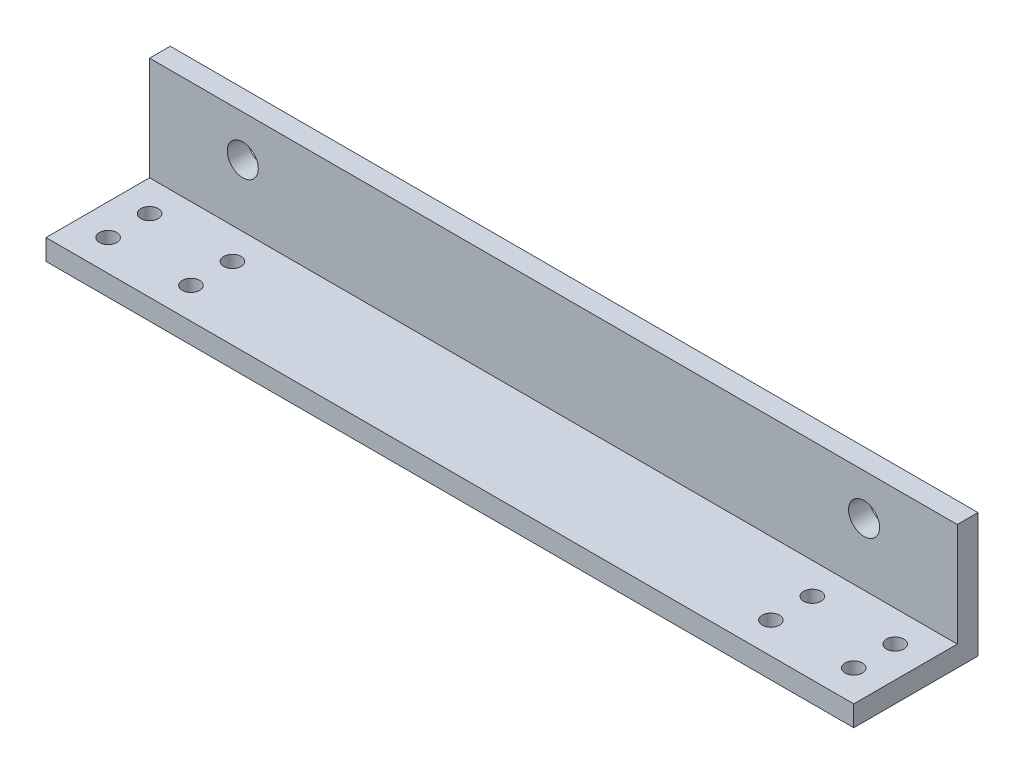
ISO-10303-21;
HEADER;
FILE_DESCRIPTION(('STEP AP214'),'2;1');
FILE_NAME('part.step','',(''),(''),'','','');
FILE_SCHEMA(('AUTOMOTIVE_DESIGN { 1 0 10303 214 1 1 1 1 }'));
ENDSEC;
DATA;
#1=APPLICATION_CONTEXT('core data for automotive mechanical design processes');
#2=APPLICATION_PROTOCOL_DEFINITION('international standard','automotive_design',2000,#1);
#3=PRODUCT_CONTEXT('',#1,'mechanical');
#4=PRODUCT('Part','Part','',(#3));
#5=PRODUCT_RELATED_PRODUCT_CATEGORY('part','',(#4));
#6=PRODUCT_DEFINITION_FORMATION('','',#4);
#7=PRODUCT_DEFINITION_CONTEXT('part definition',#1,'design');
#8=PRODUCT_DEFINITION('design','',#6,#7);
#9=PRODUCT_DEFINITION_SHAPE('','',#8);
#10=(LENGTH_UNIT() NAMED_UNIT(*) SI_UNIT(.MILLI.,.METRE.));
#11=(NAMED_UNIT(*) PLANE_ANGLE_UNIT() SI_UNIT($,.RADIAN.));
#12=(NAMED_UNIT(*) SI_UNIT($,.STERADIAN.) SOLID_ANGLE_UNIT());
#13=UNCERTAINTY_MEASURE_WITH_UNIT(LENGTH_MEASURE(1.E-05),#10,'distance_accuracy_value','');
#14=(GEOMETRIC_REPRESENTATION_CONTEXT(3) GLOBAL_UNCERTAINTY_ASSIGNED_CONTEXT((#13)) GLOBAL_UNIT_ASSIGNED_CONTEXT((#10,
#11,#12)) REPRESENTATION_CONTEXT('',''));
#15=CARTESIAN_POINT('',(0.,0.,0.));
#16=DIRECTION('',(0.,0.,1.));
#17=DIRECTION('',(1.,0.,0.));
#18=AXIS2_PLACEMENT_3D('',#15,#16,#17);
#19=CARTESIAN_POINT('',(123.825,0.,0.));
#20=DIRECTION('',(0.,0.,1.));
#21=DIRECTION('',(1.,0.,0.));
#22=AXIS2_PLACEMENT_3D('',#19,#20,#21);
#23=PLANE('',#22);
#24=CARTESIAN_POINT('',(-95.25,25.4,0.));
#25=DIRECTION('',(0.,0.,1.));
#26=DIRECTION('',(1.,0.,0.));
#27=AXIS2_PLACEMENT_3D('',#24,#25,#26);
#28=CIRCLE('',#27,4.7625);
#29=CARTESIAN_POINT('',(-90.4875,25.4,0.));
#30=VERTEX_POINT('',#29);
#31=EDGE_CURVE('E164',#30,#30,#28,.T.);
#32=ORIENTED_EDGE('',*,*,#31,.T.);
#33=EDGE_LOOP('',(#32));
#34=FACE_BOUND('',#33,.T.);
#35=CARTESIAN_POINT('',(95.25,25.4,0.));
#36=DIRECTION('',(0.,0.,1.));
#37=DIRECTION('',(1.,0.,0.));
#38=AXIS2_PLACEMENT_3D('',#35,#36,#37);
#39=CIRCLE('',#38,4.7625);
#40=CARTESIAN_POINT('',(100.0125,25.4,0.));
#41=VERTEX_POINT('',#40);
#42=EDGE_CURVE('E167',#41,#41,#39,.T.);
#43=ORIENTED_EDGE('',*,*,#42,.T.);
#44=EDGE_LOOP('',(#43));
#45=FACE_BOUND('',#44,.T.);
#46=DIRECTION('',(0.,1.,0.));
#47=VECTOR('',#46,1.);
#48=CARTESIAN_POINT('',(-123.825,0.,0.));
#49=LINE('',#48,#47);
#50=CARTESIAN_POINT('',(-123.825,0.,0.));
#51=VERTEX_POINT('',#50);
#52=CARTESIAN_POINT('',(-123.825,38.1,0.));
#53=VERTEX_POINT('',#52);
#54=EDGE_CURVE('E116',#51,#53,#49,.T.);
#55=ORIENTED_EDGE('',*,*,#54,.T.);
#56=DIRECTION('',(-1.,0.,0.));
#57=VECTOR('',#56,1.);
#58=CARTESIAN_POINT('',(123.825,38.1,0.));
#59=LINE('',#58,#57);
#60=CARTESIAN_POINT('',(123.825,38.1,0.));
#61=VERTEX_POINT('',#60);
#62=EDGE_CURVE('E11',#61,#53,#59,.T.);
#63=ORIENTED_EDGE('',*,*,#62,.F.);
#64=DIRECTION('',(0.,1.,0.));
#65=VECTOR('',#64,1.);
#66=CARTESIAN_POINT('',(123.825,0.,0.));
#67=LINE('',#66,#65);
#68=CARTESIAN_POINT('',(123.825,0.,0.));
#69=VERTEX_POINT('',#68);
#70=EDGE_CURVE('E81',#69,#61,#67,.T.);
#71=ORIENTED_EDGE('',*,*,#70,.F.);
#72=DIRECTION('',(-1.,0.,0.));
#73=VECTOR('',#72,1.);
#74=CARTESIAN_POINT('',(123.825,0.,0.));
#75=LINE('',#74,#73);
#76=EDGE_CURVE('E112',#69,#51,#75,.T.);
#77=ORIENTED_EDGE('',*,*,#76,.T.);
#78=EDGE_LOOP('',(#55,#63,#71,#77));
#79=FACE_BOUND('',#78,.T.);
#80=ADVANCED_FACE('F35',(#34,#45,#79),#23,.F.);
#81=CARTESIAN_POINT('',(123.825,38.1,6.35));
#82=DIRECTION('',(0.,1.,0.));
#83=DIRECTION('',(0.,0.,1.));
#84=AXIS2_PLACEMENT_3D('',#81,#82,#83);
#85=PLANE('',#84);
#86=DIRECTION('',(0.,0.,-1.));
#87=VECTOR('',#86,1.);
#88=CARTESIAN_POINT('',(-123.825,38.1,6.35));
#89=LINE('',#88,#87);
#90=CARTESIAN_POINT('',(-123.825,38.1,6.35));
#91=VERTEX_POINT('',#90);
#92=EDGE_CURVE('E119',#91,#53,#89,.T.);
#93=ORIENTED_EDGE('',*,*,#92,.F.);
#94=DIRECTION('',(-1.,0.,0.));
#95=VECTOR('',#94,1.);
#96=CARTESIAN_POINT('',(123.825,38.1,6.35));
#97=LINE('',#96,#95);
#98=CARTESIAN_POINT('',(123.825,38.1,6.35));
#99=VERTEX_POINT('',#98);
#100=EDGE_CURVE('E43',#99,#91,#97,.T.);
#101=ORIENTED_EDGE('',*,*,#100,.F.);
#102=DIRECTION('',(0.,0.,-1.));
#103=VECTOR('',#102,1.);
#104=CARTESIAN_POINT('',(123.825,38.1,6.35));
#105=LINE('',#104,#103);
#106=EDGE_CURVE('E222',#99,#61,#105,.T.);
#107=ORIENTED_EDGE('',*,*,#106,.T.);
#108=ORIENTED_EDGE('',*,*,#62,.T.);
#109=EDGE_LOOP('',(#93,#101,#107,#108));
#110=FACE_BOUND('',#109,.T.);
#111=ADVANCED_FACE('F138',(#110),#85,.T.);
#112=CARTESIAN_POINT('',(123.825,0.,6.35));
#113=DIRECTION('',(0.,0.,1.));
#114=DIRECTION('',(1.,0.,0.));
#115=AXIS2_PLACEMENT_3D('',#112,#113,#114);
#116=PLANE('',#115);
#117=CARTESIAN_POINT('',(-95.25,25.4,6.35));
#118=DIRECTION('',(0.,0.,1.));
#119=DIRECTION('',(1.,0.,0.));
#120=AXIS2_PLACEMENT_3D('',#117,#118,#119);
#121=CIRCLE('',#120,4.7625);
#122=CARTESIAN_POINT('',(-90.4875,25.4,6.35));
#123=VERTEX_POINT('',#122);
#124=EDGE_CURVE('E374',#123,#123,#121,.T.);
#125=ORIENTED_EDGE('',*,*,#124,.F.);
#126=EDGE_LOOP('',(#125));
#127=FACE_BOUND('',#126,.T.);
#128=CARTESIAN_POINT('',(95.25,25.4,6.35));
#129=DIRECTION('',(0.,0.,1.));
#130=DIRECTION('',(1.,0.,0.));
#131=AXIS2_PLACEMENT_3D('',#128,#129,#130);
#132=CIRCLE('',#131,4.7625);
#133=CARTESIAN_POINT('',(100.0125,25.4,6.35));
#134=VERTEX_POINT('',#133);
#135=EDGE_CURVE('E170',#134,#134,#132,.T.);
#136=ORIENTED_EDGE('',*,*,#135,.F.);
#137=EDGE_LOOP('',(#136));
#138=FACE_BOUND('',#137,.T.);
#139=DIRECTION('',(0.,1.,0.));
#140=VECTOR('',#139,1.);
#141=CARTESIAN_POINT('',(-123.825,0.,6.35));
#142=LINE('',#141,#140);
#143=CARTESIAN_POINT('',(-123.825,6.35,6.35));
#144=VERTEX_POINT('',#143);
#145=EDGE_CURVE('E123',#144,#91,#142,.T.);
#146=ORIENTED_EDGE('',*,*,#145,.F.);
#147=DIRECTION('',(-1.,0.,0.));
#148=VECTOR('',#147,1.);
#149=CARTESIAN_POINT('',(123.825,6.35,6.35));
#150=LINE('',#149,#148);
#151=CARTESIAN_POINT('',(123.825,6.35,6.35));
#152=VERTEX_POINT('',#151);
#153=EDGE_CURVE('E102',#152,#144,#150,.T.);
#154=ORIENTED_EDGE('',*,*,#153,.F.);
#155=DIRECTION('',(0.,1.,0.));
#156=VECTOR('',#155,1.);
#157=CARTESIAN_POINT('',(123.825,0.,6.35));
#158=LINE('',#157,#156);
#159=EDGE_CURVE('E108',#152,#99,#158,.T.);
#160=ORIENTED_EDGE('',*,*,#159,.T.);
#161=ORIENTED_EDGE('',*,*,#100,.T.);
#162=EDGE_LOOP('',(#146,#154,#160,#161));
#163=FACE_BOUND('',#162,.T.);
#164=ADVANCED_FACE('F135',(#127,#138,#163),#116,.T.);
#165=CARTESIAN_POINT('',(123.825,6.35,38.1));
#166=DIRECTION('',(0.,1.,0.));
#167=DIRECTION('',(0.,0.,1.));
#168=AXIS2_PLACEMENT_3D('',#165,#166,#167);
#169=PLANE('',#168);
#170=CARTESIAN_POINT('',(-114.3,6.35,15.875));
#171=DIRECTION('',(0.,1.,0.));
#172=DIRECTION('',(0.,0.,1.));
#173=AXIS2_PLACEMENT_3D('',#170,#171,#172);
#174=CIRCLE('',#173,2.66699999999999);
#175=CARTESIAN_POINT('',(-114.3,6.35,18.542));
#176=VERTEX_POINT('',#175);
#177=EDGE_CURVE('E169',#176,#176,#174,.T.);
#178=ORIENTED_EDGE('',*,*,#177,.F.);
#179=EDGE_LOOP('',(#178));
#180=FACE_BOUND('',#179,.T.);
#181=CARTESIAN_POINT('',(-114.3,6.35,28.575));
#182=DIRECTION('',(0.,1.,0.));
#183=DIRECTION('',(0.,0.,1.));
#184=AXIS2_PLACEMENT_3D('',#181,#182,#183);
#185=CIRCLE('',#184,2.66699999999999);
#186=CARTESIAN_POINT('',(-114.3,6.35,31.242));
#187=VERTEX_POINT('',#186);
#188=EDGE_CURVE('E180',#187,#187,#185,.T.);
#189=ORIENTED_EDGE('',*,*,#188,.F.);
#190=EDGE_LOOP('',(#189));
#191=FACE_BOUND('',#190,.T.);
#192=CARTESIAN_POINT('',(-88.9,6.35,28.575));
#193=DIRECTION('',(0.,1.,0.));
#194=DIRECTION('',(0.,0.,1.));
#195=AXIS2_PLACEMENT_3D('',#192,#193,#194);
#196=CIRCLE('',#195,2.66699999999999);
#197=CARTESIAN_POINT('',(-88.9,6.35,31.242));
#198=VERTEX_POINT('',#197);
#199=EDGE_CURVE('E186',#198,#198,#196,.T.);
#200=ORIENTED_EDGE('',*,*,#199,.F.);
#201=EDGE_LOOP('',(#200));
#202=FACE_BOUND('',#201,.T.);
#203=CARTESIAN_POINT('',(-88.9,6.35,15.875));
#204=DIRECTION('',(0.,1.,0.));
#205=DIRECTION('',(0.,0.,1.));
#206=AXIS2_PLACEMENT_3D('',#203,#204,#205);
#207=CIRCLE('',#206,2.66699999999999);
#208=CARTESIAN_POINT('',(-88.9,6.35,18.542));
#209=VERTEX_POINT('',#208);
#210=EDGE_CURVE('E192',#209,#209,#207,.T.);
#211=ORIENTED_EDGE('',*,*,#210,.F.);
#212=EDGE_LOOP('',(#211));
#213=FACE_BOUND('',#212,.T.);
#214=CARTESIAN_POINT('',(88.9,6.35,15.875));
#215=DIRECTION('',(0.,1.,0.));
#216=DIRECTION('',(0.,0.,1.));
#217=AXIS2_PLACEMENT_3D('',#214,#215,#216);
#218=CIRCLE('',#217,2.66699999999999);
#219=CARTESIAN_POINT('',(88.9,6.35,18.542));
#220=VERTEX_POINT('',#219);
#221=EDGE_CURVE('E198',#220,#220,#218,.T.);
#222=ORIENTED_EDGE('',*,*,#221,.F.);
#223=EDGE_LOOP('',(#222));
#224=FACE_BOUND('',#223,.T.);
#225=CARTESIAN_POINT('',(88.9,6.35,28.575));
#226=DIRECTION('',(0.,1.,0.));
#227=DIRECTION('',(0.,0.,1.));
#228=AXIS2_PLACEMENT_3D('',#225,#226,#227);
#229=CIRCLE('',#228,2.66699999999999);
#230=CARTESIAN_POINT('',(88.9,6.35,31.242));
#231=VERTEX_POINT('',#230);
#232=EDGE_CURVE('E204',#231,#231,#229,.T.);
#233=ORIENTED_EDGE('',*,*,#232,.F.);
#234=EDGE_LOOP('',(#233));
#235=FACE_BOUND('',#234,.T.);
#236=CARTESIAN_POINT('',(114.3,6.35,28.575));
#237=DIRECTION('',(0.,1.,0.));
#238=DIRECTION('',(0.,0.,1.));
#239=AXIS2_PLACEMENT_3D('',#236,#237,#238);
#240=CIRCLE('',#239,2.66699999999999);
#241=CARTESIAN_POINT('',(114.3,6.35,31.242));
#242=VERTEX_POINT('',#241);
#243=EDGE_CURVE('E210',#242,#242,#240,.T.);
#244=ORIENTED_EDGE('',*,*,#243,.F.);
#245=EDGE_LOOP('',(#244));
#246=FACE_BOUND('',#245,.T.);
#247=CARTESIAN_POINT('',(114.3,6.35,15.875));
#248=DIRECTION('',(0.,1.,0.));
#249=DIRECTION('',(0.,0.,1.));
#250=AXIS2_PLACEMENT_3D('',#247,#248,#249);
#251=CIRCLE('',#250,2.66699999999999);
#252=CARTESIAN_POINT('',(114.3,6.35,18.542));
#253=VERTEX_POINT('',#252);
#254=EDGE_CURVE('E216',#253,#253,#251,.T.);
#255=ORIENTED_EDGE('',*,*,#254,.F.);
#256=EDGE_LOOP('',(#255));
#257=FACE_BOUND('',#256,.T.);
#258=DIRECTION('',(0.,0.,-1.));
#259=VECTOR('',#258,1.);
#260=CARTESIAN_POINT('',(-123.825,6.35,38.1));
#261=LINE('',#260,#259);
#262=CARTESIAN_POINT('',(-123.825,6.35,38.1));
#263=VERTEX_POINT('',#262);
#264=EDGE_CURVE('E97',#263,#144,#261,.T.);
#265=ORIENTED_EDGE('',*,*,#264,.F.);
#266=DIRECTION('',(-1.,0.,0.));
#267=VECTOR('',#266,1.);
#268=CARTESIAN_POINT('',(123.825,6.35,38.1));
#269=LINE('',#268,#267);
#270=CARTESIAN_POINT('',(123.825,6.35,38.1));
#271=VERTEX_POINT('',#270);
#272=EDGE_CURVE('E92',#271,#263,#269,.T.);
#273=ORIENTED_EDGE('',*,*,#272,.F.);
#274=DIRECTION('',(0.,0.,-1.));
#275=VECTOR('',#274,1.);
#276=CARTESIAN_POINT('',(123.825,6.35,38.1));
#277=LINE('',#276,#275);
#278=EDGE_CURVE('E95',#271,#152,#277,.T.);
#279=ORIENTED_EDGE('',*,*,#278,.T.);
#280=ORIENTED_EDGE('',*,*,#153,.T.);
#281=EDGE_LOOP('',(#265,#273,#279,#280));
#282=FACE_BOUND('',#281,.T.);
#283=ADVANCED_FACE('F94',(#180,#191,#202,#213,#224,#235,#246,#257,#282),#169,.T.);
#284=CARTESIAN_POINT('',(123.825,0.,38.1));
#285=DIRECTION('',(0.,0.,1.));
#286=DIRECTION('',(1.,0.,0.));
#287=AXIS2_PLACEMENT_3D('',#284,#285,#286);
#288=PLANE('',#287);
#289=DIRECTION('',(0.,1.,0.));
#290=VECTOR('',#289,1.);
#291=CARTESIAN_POINT('',(-123.825,0.,38.1));
#292=LINE('',#291,#290);
#293=CARTESIAN_POINT('',(-123.825,0.,38.1));
#294=VERTEX_POINT('',#293);
#295=EDGE_CURVE('E127',#294,#263,#292,.T.);
#296=ORIENTED_EDGE('',*,*,#295,.F.);
#297=DIRECTION('',(-1.,0.,0.));
#298=VECTOR('',#297,1.);
#299=CARTESIAN_POINT('',(123.825,0.,38.1));
#300=LINE('',#299,#298);
#301=CARTESIAN_POINT('',(123.825,0.,38.1));
#302=VERTEX_POINT('',#301);
#303=EDGE_CURVE('E72',#302,#294,#300,.T.);
#304=ORIENTED_EDGE('',*,*,#303,.F.);
#305=DIRECTION('',(0.,1.,0.));
#306=VECTOR('',#305,1.);
#307=CARTESIAN_POINT('',(123.825,0.,38.1));
#308=LINE('',#307,#306);
#309=EDGE_CURVE('E106',#302,#271,#308,.T.);
#310=ORIENTED_EDGE('',*,*,#309,.T.);
#311=ORIENTED_EDGE('',*,*,#272,.T.);
#312=EDGE_LOOP('',(#296,#304,#310,#311));
#313=FACE_BOUND('',#312,.T.);
#314=ADVANCED_FACE('F110',(#313),#288,.T.);
#315=CARTESIAN_POINT('',(123.825,0.,38.1));
#316=DIRECTION('',(0.,1.,0.));
#317=DIRECTION('',(0.,0.,1.));
#318=AXIS2_PLACEMENT_3D('',#315,#316,#317);
#319=PLANE('',#318);
#320=CARTESIAN_POINT('',(-114.3,0.,15.875));
#321=DIRECTION('',(0.,1.,0.));
#322=DIRECTION('',(0.,0.,1.));
#323=AXIS2_PLACEMENT_3D('',#320,#321,#322);
#324=CIRCLE('',#323,2.667);
#325=CARTESIAN_POINT('',(-114.3,0.,18.542));
#326=VERTEX_POINT('',#325);
#327=EDGE_CURVE('E173',#326,#326,#324,.T.);
#328=ORIENTED_EDGE('',*,*,#327,.T.);
#329=EDGE_LOOP('',(#328));
#330=FACE_BOUND('',#329,.T.);
#331=CARTESIAN_POINT('',(-114.3,0.,28.575));
#332=DIRECTION('',(0.,1.,0.));
#333=DIRECTION('',(0.,0.,1.));
#334=AXIS2_PLACEMENT_3D('',#331,#332,#333);
#335=CIRCLE('',#334,2.667);
#336=CARTESIAN_POINT('',(-114.3,0.,31.242));
#337=VERTEX_POINT('',#336);
#338=EDGE_CURVE('E183',#337,#337,#335,.T.);
#339=ORIENTED_EDGE('',*,*,#338,.T.);
#340=EDGE_LOOP('',(#339));
#341=FACE_BOUND('',#340,.T.);
#342=CARTESIAN_POINT('',(-88.9,0.,28.575));
#343=DIRECTION('',(0.,1.,0.));
#344=DIRECTION('',(0.,0.,1.));
#345=AXIS2_PLACEMENT_3D('',#342,#343,#344);
#346=CIRCLE('',#345,2.667);
#347=CARTESIAN_POINT('',(-88.9,0.,31.242));
#348=VERTEX_POINT('',#347);
#349=EDGE_CURVE('E189',#348,#348,#346,.T.);
#350=ORIENTED_EDGE('',*,*,#349,.T.);
#351=EDGE_LOOP('',(#350));
#352=FACE_BOUND('',#351,.T.);
#353=CARTESIAN_POINT('',(-88.9,0.,15.875));
#354=DIRECTION('',(0.,1.,0.));
#355=DIRECTION('',(0.,0.,1.));
#356=AXIS2_PLACEMENT_3D('',#353,#354,#355);
#357=CIRCLE('',#356,2.667);
#358=CARTESIAN_POINT('',(-88.9,0.,18.542));
#359=VERTEX_POINT('',#358);
#360=EDGE_CURVE('E195',#359,#359,#357,.T.);
#361=ORIENTED_EDGE('',*,*,#360,.T.);
#362=EDGE_LOOP('',(#361));
#363=FACE_BOUND('',#362,.T.);
#364=CARTESIAN_POINT('',(88.9,0.,15.875));
#365=DIRECTION('',(0.,1.,0.));
#366=DIRECTION('',(0.,0.,1.));
#367=AXIS2_PLACEMENT_3D('',#364,#365,#366);
#368=CIRCLE('',#367,2.667);
#369=CARTESIAN_POINT('',(88.9,0.,18.542));
#370=VERTEX_POINT('',#369);
#371=EDGE_CURVE('E201',#370,#370,#368,.T.);
#372=ORIENTED_EDGE('',*,*,#371,.T.);
#373=EDGE_LOOP('',(#372));
#374=FACE_BOUND('',#373,.T.);
#375=CARTESIAN_POINT('',(88.9,0.,28.575));
#376=DIRECTION('',(0.,1.,0.));
#377=DIRECTION('',(0.,0.,1.));
#378=AXIS2_PLACEMENT_3D('',#375,#376,#377);
#379=CIRCLE('',#378,2.667);
#380=CARTESIAN_POINT('',(88.9,0.,31.242));
#381=VERTEX_POINT('',#380);
#382=EDGE_CURVE('E207',#381,#381,#379,.T.);
#383=ORIENTED_EDGE('',*,*,#382,.T.);
#384=EDGE_LOOP('',(#383));
#385=FACE_BOUND('',#384,.T.);
#386=CARTESIAN_POINT('',(114.3,0.,28.575));
#387=DIRECTION('',(0.,1.,0.));
#388=DIRECTION('',(0.,0.,1.));
#389=AXIS2_PLACEMENT_3D('',#386,#387,#388);
#390=CIRCLE('',#389,2.667);
#391=CARTESIAN_POINT('',(114.3,0.,31.242));
#392=VERTEX_POINT('',#391);
#393=EDGE_CURVE('E213',#392,#392,#390,.T.);
#394=ORIENTED_EDGE('',*,*,#393,.T.);
#395=EDGE_LOOP('',(#394));
#396=FACE_BOUND('',#395,.T.);
#397=CARTESIAN_POINT('',(114.3,0.,15.875));
#398=DIRECTION('',(0.,1.,0.));
#399=DIRECTION('',(0.,0.,1.));
#400=AXIS2_PLACEMENT_3D('',#397,#398,#399);
#401=CIRCLE('',#400,2.667);
#402=CARTESIAN_POINT('',(114.3,0.,18.542));
#403=VERTEX_POINT('',#402);
#404=EDGE_CURVE('E120',#403,#403,#401,.T.);
#405=ORIENTED_EDGE('',*,*,#404,.T.);
#406=EDGE_LOOP('',(#405));
#407=FACE_BOUND('',#406,.T.);
#408=DIRECTION('',(0.,0.,-1.));
#409=VECTOR('',#408,1.);
#410=CARTESIAN_POINT('',(-123.825,0.,38.1));
#411=LINE('',#410,#409);
#412=EDGE_CURVE('E75',#294,#51,#411,.T.);
#413=ORIENTED_EDGE('',*,*,#412,.T.);
#414=ORIENTED_EDGE('',*,*,#76,.F.);
#415=DIRECTION('',(0.,0.,-1.));
#416=VECTOR('',#415,1.);
#417=CARTESIAN_POINT('',(123.825,0.,38.1));
#418=LINE('',#417,#416);
#419=EDGE_CURVE('E51',#302,#69,#418,.T.);
#420=ORIENTED_EDGE('',*,*,#419,.F.);
#421=ORIENTED_EDGE('',*,*,#303,.T.);
#422=EDGE_LOOP('',(#413,#414,#420,#421));
#423=FACE_BOUND('',#422,.T.);
#424=ADVANCED_FACE('F143',(#330,#341,#352,#363,#374,#385,#396,#407,#423),#319,.F.);
#425=CARTESIAN_POINT('',(123.825,0.,0.));
#426=DIRECTION('',(-1.,0.,0.));
#427=DIRECTION('',(0.,0.,1.));
#428=AXIS2_PLACEMENT_3D('',#425,#426,#427);
#429=PLANE('',#428);
#430=ORIENTED_EDGE('',*,*,#70,.T.);
#431=ORIENTED_EDGE('',*,*,#106,.F.);
#432=ORIENTED_EDGE('',*,*,#159,.F.);
#433=ORIENTED_EDGE('',*,*,#278,.F.);
#434=ORIENTED_EDGE('',*,*,#309,.F.);
#435=ORIENTED_EDGE('',*,*,#419,.T.);
#436=EDGE_LOOP('',(#430,#431,#432,#433,#434,#435));
#437=FACE_BOUND('',#436,.T.);
#438=ADVANCED_FACE('F105',(#437),#429,.F.);
#439=CARTESIAN_POINT('',(-123.825,0.,0.));
#440=DIRECTION('',(-1.,0.,0.));
#441=DIRECTION('',(0.,0.,1.));
#442=AXIS2_PLACEMENT_3D('',#439,#440,#441);
#443=PLANE('',#442);
#444=ORIENTED_EDGE('',*,*,#54,.F.);
#445=ORIENTED_EDGE('',*,*,#412,.F.);
#446=ORIENTED_EDGE('',*,*,#295,.T.);
#447=ORIENTED_EDGE('',*,*,#264,.T.);
#448=ORIENTED_EDGE('',*,*,#145,.T.);
#449=ORIENTED_EDGE('',*,*,#92,.T.);
#450=EDGE_LOOP('',(#444,#445,#446,#447,#448,#449));
#451=FACE_BOUND('',#450,.T.);
#452=ADVANCED_FACE('F141',(#451),#443,.T.);
#453=CARTESIAN_POINT('',(114.3,6.35,15.875));
#454=DIRECTION('',(0.,1.,0.));
#455=DIRECTION('',(0.,0.,1.));
#456=AXIS2_PLACEMENT_3D('',#453,#454,#455);
#457=CYLINDRICAL_SURFACE('',#456,2.667);
#458=ORIENTED_EDGE('',*,*,#404,.F.);
#459=EDGE_LOOP('',(#458));
#460=FACE_BOUND('',#459,.T.);
#461=ORIENTED_EDGE('',*,*,#254,.T.);
#462=EDGE_LOOP('',(#461));
#463=FACE_BOUND('',#462,.T.);
#464=ADVANCED_FACE('F226',(#460,#463),#457,.F.);
#465=CARTESIAN_POINT('',(114.3,6.35,28.575));
#466=DIRECTION('',(0.,1.,0.));
#467=DIRECTION('',(0.,0.,1.));
#468=AXIS2_PLACEMENT_3D('',#465,#466,#467);
#469=CYLINDRICAL_SURFACE('',#468,2.667);
#470=ORIENTED_EDGE('',*,*,#393,.F.);
#471=EDGE_LOOP('',(#470));
#472=FACE_BOUND('',#471,.T.);
#473=ORIENTED_EDGE('',*,*,#243,.T.);
#474=EDGE_LOOP('',(#473));
#475=FACE_BOUND('',#474,.T.);
#476=ADVANCED_FACE('F229',(#472,#475),#469,.F.);
#477=CARTESIAN_POINT('',(88.9,6.35,28.575));
#478=DIRECTION('',(0.,1.,0.));
#479=DIRECTION('',(0.,0.,1.));
#480=AXIS2_PLACEMENT_3D('',#477,#478,#479);
#481=CYLINDRICAL_SURFACE('',#480,2.667);
#482=ORIENTED_EDGE('',*,*,#382,.F.);
#483=EDGE_LOOP('',(#482));
#484=FACE_BOUND('',#483,.T.);
#485=ORIENTED_EDGE('',*,*,#232,.T.);
#486=EDGE_LOOP('',(#485));
#487=FACE_BOUND('',#486,.T.);
#488=ADVANCED_FACE('F256',(#484,#487),#481,.F.);
#489=CARTESIAN_POINT('',(88.9,6.35,15.875));
#490=DIRECTION('',(0.,1.,0.));
#491=DIRECTION('',(0.,0.,1.));
#492=AXIS2_PLACEMENT_3D('',#489,#490,#491);
#493=CYLINDRICAL_SURFACE('',#492,2.667);
#494=ORIENTED_EDGE('',*,*,#371,.F.);
#495=EDGE_LOOP('',(#494));
#496=FACE_BOUND('',#495,.T.);
#497=ORIENTED_EDGE('',*,*,#221,.T.);
#498=EDGE_LOOP('',(#497));
#499=FACE_BOUND('',#498,.T.);
#500=ADVANCED_FACE('F262',(#496,#499),#493,.F.);
#501=CARTESIAN_POINT('',(-88.9,6.35,15.875));
#502=DIRECTION('',(0.,1.,0.));
#503=DIRECTION('',(0.,0.,1.));
#504=AXIS2_PLACEMENT_3D('',#501,#502,#503);
#505=CYLINDRICAL_SURFACE('',#504,2.667);
#506=ORIENTED_EDGE('',*,*,#360,.F.);
#507=EDGE_LOOP('',(#506));
#508=FACE_BOUND('',#507,.T.);
#509=ORIENTED_EDGE('',*,*,#210,.T.);
#510=EDGE_LOOP('',(#509));
#511=FACE_BOUND('',#510,.T.);
#512=ADVANCED_FACE('F297',(#508,#511),#505,.F.);
#513=CARTESIAN_POINT('',(-88.9,6.35,28.575));
#514=DIRECTION('',(0.,1.,0.));
#515=DIRECTION('',(0.,0.,1.));
#516=AXIS2_PLACEMENT_3D('',#513,#514,#515);
#517=CYLINDRICAL_SURFACE('',#516,2.667);
#518=ORIENTED_EDGE('',*,*,#349,.F.);
#519=EDGE_LOOP('',(#518));
#520=FACE_BOUND('',#519,.T.);
#521=ORIENTED_EDGE('',*,*,#199,.T.);
#522=EDGE_LOOP('',(#521));
#523=FACE_BOUND('',#522,.T.);
#524=ADVANCED_FACE('F306',(#520,#523),#517,.F.);
#525=CARTESIAN_POINT('',(-114.3,6.35,28.575));
#526=DIRECTION('',(0.,1.,0.));
#527=DIRECTION('',(0.,0.,1.));
#528=AXIS2_PLACEMENT_3D('',#525,#526,#527);
#529=CYLINDRICAL_SURFACE('',#528,2.667);
#530=ORIENTED_EDGE('',*,*,#338,.F.);
#531=EDGE_LOOP('',(#530));
#532=FACE_BOUND('',#531,.T.);
#533=ORIENTED_EDGE('',*,*,#188,.T.);
#534=EDGE_LOOP('',(#533));
#535=FACE_BOUND('',#534,.T.);
#536=ADVANCED_FACE('F316',(#532,#535),#529,.F.);
#537=CARTESIAN_POINT('',(-114.3,6.35,15.875));
#538=DIRECTION('',(0.,1.,0.));
#539=DIRECTION('',(0.,0.,1.));
#540=AXIS2_PLACEMENT_3D('',#537,#538,#539);
#541=CYLINDRICAL_SURFACE('',#540,2.667);
#542=ORIENTED_EDGE('',*,*,#327,.F.);
#543=EDGE_LOOP('',(#542));
#544=FACE_BOUND('',#543,.T.);
#545=ORIENTED_EDGE('',*,*,#177,.T.);
#546=EDGE_LOOP('',(#545));
#547=FACE_BOUND('',#546,.T.);
#548=ADVANCED_FACE('F326',(#544,#547),#541,.F.);
#549=CARTESIAN_POINT('',(95.25,25.4,6.35));
#550=DIRECTION('',(0.,0.,1.));
#551=DIRECTION('',(1.,0.,0.));
#552=AXIS2_PLACEMENT_3D('',#549,#550,#551);
#553=CYLINDRICAL_SURFACE('',#552,4.7625);
#554=ORIENTED_EDGE('',*,*,#42,.F.);
#555=EDGE_LOOP('',(#554));
#556=FACE_BOUND('',#555,.T.);
#557=ORIENTED_EDGE('',*,*,#135,.T.);
#558=EDGE_LOOP('',(#557));
#559=FACE_BOUND('',#558,.T.);
#560=ADVANCED_FACE('F335',(#556,#559),#553,.F.);
#561=CARTESIAN_POINT('',(-95.25,25.4,6.35));
#562=DIRECTION('',(0.,0.,1.));
#563=DIRECTION('',(1.,0.,0.));
#564=AXIS2_PLACEMENT_3D('',#561,#562,#563);
#565=CYLINDRICAL_SURFACE('',#564,4.7625);
#566=ORIENTED_EDGE('',*,*,#31,.F.);
#567=EDGE_LOOP('',(#566));
#568=FACE_BOUND('',#567,.T.);
#569=ORIENTED_EDGE('',*,*,#124,.T.);
#570=EDGE_LOOP('',(#569));
#571=FACE_BOUND('',#570,.T.);
#572=ADVANCED_FACE('F358',(#568,#571),#565,.F.);
#573=CLOSED_SHELL('',(#80,#111,#164,#283,#314,#424,#438,#452,#464,#476,#488,#500,#512,#524,#536,
#548,#560,#572));
#574=MANIFOLD_SOLID_BREP('B2',#573);
#575=ADVANCED_BREP_SHAPE_REPRESENTATION('',(#18,#574),#14);
#576=SHAPE_DEFINITION_REPRESENTATION(#9,#575);
ENDSEC;
END-ISO-10303-21;
